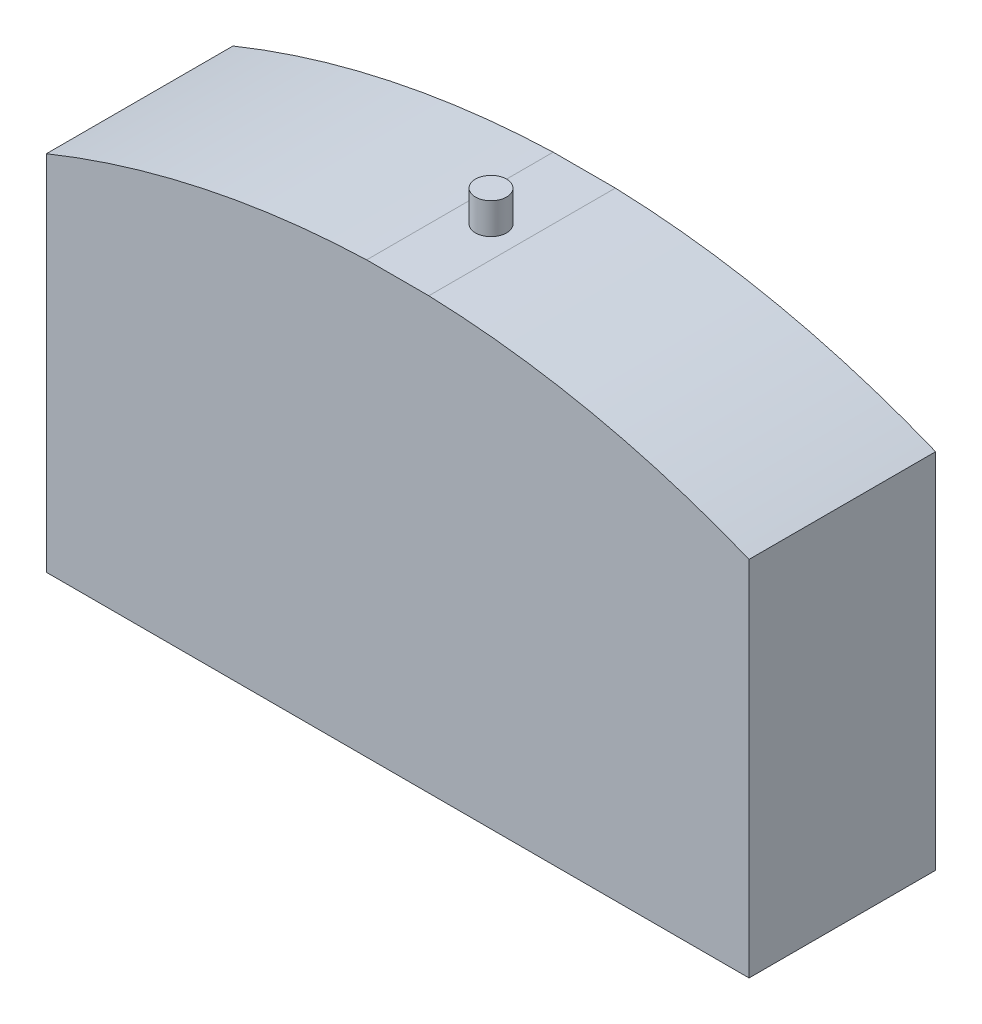
ISO-10303-21;
HEADER;
FILE_DESCRIPTION(('STEP AP214'),'2;1');
FILE_NAME('part.step','',(''),(''),'','','');
FILE_SCHEMA(('AUTOMOTIVE_DESIGN { 1 0 10303 214 1 1 1 1 }'));
ENDSEC;
DATA;
#1=APPLICATION_CONTEXT('core data for automotive mechanical design processes');
#2=APPLICATION_PROTOCOL_DEFINITION('international standard','automotive_design',2000,#1);
#3=PRODUCT_CONTEXT('',#1,'mechanical');
#4=PRODUCT('Part','Part','',(#3));
#5=PRODUCT_RELATED_PRODUCT_CATEGORY('part','',(#4));
#6=PRODUCT_DEFINITION_FORMATION('','',#4);
#7=PRODUCT_DEFINITION_CONTEXT('part definition',#1,'design');
#8=PRODUCT_DEFINITION('design','',#6,#7);
#9=PRODUCT_DEFINITION_SHAPE('','',#8);
#10=(LENGTH_UNIT() NAMED_UNIT(*) SI_UNIT(.MILLI.,.METRE.));
#11=(NAMED_UNIT(*) PLANE_ANGLE_UNIT() SI_UNIT($,.RADIAN.));
#12=(NAMED_UNIT(*) SI_UNIT($,.STERADIAN.) SOLID_ANGLE_UNIT());
#13=UNCERTAINTY_MEASURE_WITH_UNIT(LENGTH_MEASURE(1.E-05),#10,'distance_accuracy_value','');
#14=(GEOMETRIC_REPRESENTATION_CONTEXT(3) GLOBAL_UNCERTAINTY_ASSIGNED_CONTEXT((#13)) GLOBAL_UNIT_ASSIGNED_CONTEXT((#10,
#11,#12)) REPRESENTATION_CONTEXT('',''));
#15=CARTESIAN_POINT('',(0.,0.,0.));
#16=DIRECTION('',(0.,0.,1.));
#17=DIRECTION('',(1.,0.,0.));
#18=AXIS2_PLACEMENT_3D('',#15,#16,#17);
#19=CARTESIAN_POINT('',(0.,0.,30.));
#20=DIRECTION('',(0.,0.,-1.));
#21=DIRECTION('',(-1.,0.,0.));
#22=AXIS2_PLACEMENT_3D('',#19,#20,#21);
#23=CYLINDRICAL_SURFACE('',#22,150.);
#24=CARTESIAN_POINT('',(0.,0.,0.));
#25=DIRECTION('',(0.,0.,1.));
#26=DIRECTION('',(1.,0.,0.));
#27=AXIS2_PLACEMENT_3D('',#24,#25,#26);
#28=CIRCLE('',#27,150.);
#29=CARTESIAN_POINT('',(-5.,149.916643505649,0.));
#30=VERTEX_POINT('',#29);
#31=CARTESIAN_POINT('',(-56.5,138.952329955276,0.));
#32=VERTEX_POINT('',#31);
#33=EDGE_CURVE('E134',#30,#32,#28,.T.);
#34=ORIENTED_EDGE('',*,*,#33,.T.);
#35=DIRECTION('',(0.,0.,-1.));
#36=VECTOR('',#35,1.);
#37=CARTESIAN_POINT('',(-56.5,138.952329955276,30.));
#38=LINE('',#37,#36);
#39=CARTESIAN_POINT('',(-56.5,138.952329955276,30.));
#40=VERTEX_POINT('',#39);
#41=EDGE_CURVE('E39',#40,#32,#38,.T.);
#42=ORIENTED_EDGE('',*,*,#41,.F.);
#43=CARTESIAN_POINT('',(0.,0.,30.));
#44=DIRECTION('',(0.,0.,1.));
#45=DIRECTION('',(1.,0.,0.));
#46=AXIS2_PLACEMENT_3D('',#43,#44,#45);
#47=CIRCLE('',#46,150.);
#48=CARTESIAN_POINT('',(-5.,149.916643505649,30.));
#49=VERTEX_POINT('',#48);
#50=EDGE_CURVE('E146',#49,#40,#47,.T.);
#51=ORIENTED_EDGE('',*,*,#50,.F.);
#52=DIRECTION('',(0.,0.,-1.));
#53=VECTOR('',#52,1.);
#54=CARTESIAN_POINT('',(-5.,149.916643505649,30.));
#55=LINE('',#54,#53);
#56=EDGE_CURVE('E130',#49,#30,#55,.T.);
#57=ORIENTED_EDGE('',*,*,#56,.T.);
#58=EDGE_LOOP('',(#34,#42,#51,#57));
#59=FACE_BOUND('',#58,.T.);
#60=ADVANCED_FACE('F36',(#59),#23,.T.);
#61=CARTESIAN_POINT('',(-56.5,138.952329955276,30.));
#62=DIRECTION('',(1.,0.,0.));
#63=DIRECTION('',(0.,1.,0.));
#64=AXIS2_PLACEMENT_3D('',#61,#62,#63);
#65=PLANE('',#64);
#66=DIRECTION('',(0.,-1.,0.));
#67=VECTOR('',#66,1.);
#68=CARTESIAN_POINT('',(-56.5,138.952329955276,0.));
#69=LINE('',#68,#67);
#70=CARTESIAN_POINT('',(-56.5,80.6523299552764,0.));
#71=VERTEX_POINT('',#70);
#72=EDGE_CURVE('E137',#32,#71,#69,.T.);
#73=ORIENTED_EDGE('',*,*,#72,.T.);
#74=DIRECTION('',(0.,0.,-1.));
#75=VECTOR('',#74,1.);
#76=CARTESIAN_POINT('',(-56.5,80.6523299552764,30.));
#77=LINE('',#76,#75);
#78=CARTESIAN_POINT('',(-56.5,80.6523299552764,30.));
#79=VERTEX_POINT('',#78);
#80=EDGE_CURVE('E149',#79,#71,#77,.T.);
#81=ORIENTED_EDGE('',*,*,#80,.F.);
#82=DIRECTION('',(0.,-1.,0.));
#83=VECTOR('',#82,1.);
#84=CARTESIAN_POINT('',(-56.5,138.952329955276,30.));
#85=LINE('',#84,#83);
#86=EDGE_CURVE('E96',#40,#79,#85,.T.);
#87=ORIENTED_EDGE('',*,*,#86,.F.);
#88=ORIENTED_EDGE('',*,*,#41,.T.);
#89=EDGE_LOOP('',(#73,#81,#87,#88));
#90=FACE_BOUND('',#89,.T.);
#91=ADVANCED_FACE('F154',(#90),#65,.F.);
#92=CARTESIAN_POINT('',(-56.5,80.6523299552764,30.));
#93=DIRECTION('',(0.,1.,0.));
#94=DIRECTION('',(0.,0.,1.));
#95=AXIS2_PLACEMENT_3D('',#92,#93,#94);
#96=PLANE('',#95);
#97=DIRECTION('',(1.,0.,0.));
#98=VECTOR('',#97,1.);
#99=CARTESIAN_POINT('',(-56.5,80.6523299552764,0.));
#100=LINE('',#99,#98);
#101=CARTESIAN_POINT('',(56.5,80.6523299552764,0.));
#102=VERTEX_POINT('',#101);
#103=EDGE_CURVE('E140',#71,#102,#100,.T.);
#104=ORIENTED_EDGE('',*,*,#103,.T.);
#105=DIRECTION('',(0.,0.,-1.));
#106=VECTOR('',#105,1.);
#107=CARTESIAN_POINT('',(56.5,80.6523299552764,30.));
#108=LINE('',#107,#106);
#109=CARTESIAN_POINT('',(56.5,80.6523299552764,30.));
#110=VERTEX_POINT('',#109);
#111=EDGE_CURVE('E125',#110,#102,#108,.T.);
#112=ORIENTED_EDGE('',*,*,#111,.F.);
#113=DIRECTION('',(1.,0.,0.));
#114=VECTOR('',#113,1.);
#115=CARTESIAN_POINT('',(-56.5,80.6523299552764,30.));
#116=LINE('',#115,#114);
#117=EDGE_CURVE('E113',#79,#110,#116,.T.);
#118=ORIENTED_EDGE('',*,*,#117,.F.);
#119=ORIENTED_EDGE('',*,*,#80,.T.);
#120=EDGE_LOOP('',(#104,#112,#118,#119));
#121=FACE_BOUND('',#120,.T.);
#122=ADVANCED_FACE('F160',(#121),#96,.F.);
#123=CARTESIAN_POINT('',(56.5,138.952329955276,30.));
#124=DIRECTION('',(-1.,0.,0.));
#125=DIRECTION('',(0.,0.,1.));
#126=AXIS2_PLACEMENT_3D('',#123,#124,#125);
#127=PLANE('',#126);
#128=DIRECTION('',(0.,1.,0.));
#129=VECTOR('',#128,1.);
#130=CARTESIAN_POINT('',(56.5,138.952329955276,0.));
#131=LINE('',#130,#129);
#132=CARTESIAN_POINT('',(56.5,138.952329955276,0.));
#133=VERTEX_POINT('',#132);
#134=EDGE_CURVE('E122',#102,#133,#131,.T.);
#135=ORIENTED_EDGE('',*,*,#134,.T.);
#136=DIRECTION('',(0.,0.,-1.));
#137=VECTOR('',#136,1.);
#138=CARTESIAN_POINT('',(56.5,138.952329955276,30.));
#139=LINE('',#138,#137);
#140=CARTESIAN_POINT('',(56.5,138.952329955276,30.));
#141=VERTEX_POINT('',#140);
#142=EDGE_CURVE('E119',#141,#133,#139,.T.);
#143=ORIENTED_EDGE('',*,*,#142,.F.);
#144=DIRECTION('',(0.,1.,0.));
#145=VECTOR('',#144,1.);
#146=CARTESIAN_POINT('',(56.5,138.952329955276,30.));
#147=LINE('',#146,#145);
#148=EDGE_CURVE('E106',#110,#141,#147,.T.);
#149=ORIENTED_EDGE('',*,*,#148,.F.);
#150=ORIENTED_EDGE('',*,*,#111,.T.);
#151=EDGE_LOOP('',(#135,#143,#149,#150));
#152=FACE_BOUND('',#151,.T.);
#153=ADVANCED_FACE('F120',(#152),#127,.F.);
#154=CARTESIAN_POINT('',(0.,0.,30.));
#155=DIRECTION('',(0.,0.,-1.));
#156=DIRECTION('',(-1.,0.,0.));
#157=AXIS2_PLACEMENT_3D('',#154,#155,#156);
#158=CYLINDRICAL_SURFACE('',#157,150.);
#159=CARTESIAN_POINT('',(0.,0.,0.));
#160=DIRECTION('',(0.,0.,1.));
#161=DIRECTION('',(1.,0.,0.));
#162=AXIS2_PLACEMENT_3D('',#159,#160,#161);
#163=CIRCLE('',#162,150.);
#164=CARTESIAN_POINT('',(5.,149.916643505649,0.));
#165=VERTEX_POINT('',#164);
#166=EDGE_CURVE('E143',#133,#165,#163,.T.);
#167=ORIENTED_EDGE('',*,*,#166,.T.);
#168=DIRECTION('',(0.,0.,-1.));
#169=VECTOR('',#168,1.);
#170=CARTESIAN_POINT('',(5.,149.916643505649,30.));
#171=LINE('',#170,#169);
#172=CARTESIAN_POINT('',(5.,149.916643505649,30.));
#173=VERTEX_POINT('',#172);
#174=EDGE_CURVE('E126',#173,#165,#171,.T.);
#175=ORIENTED_EDGE('',*,*,#174,.F.);
#176=CARTESIAN_POINT('',(0.,0.,30.));
#177=DIRECTION('',(0.,0.,1.));
#178=DIRECTION('',(1.,0.,0.));
#179=AXIS2_PLACEMENT_3D('',#176,#177,#178);
#180=CIRCLE('',#179,150.);
#181=EDGE_CURVE('E110',#141,#173,#180,.T.);
#182=ORIENTED_EDGE('',*,*,#181,.F.);
#183=ORIENTED_EDGE('',*,*,#142,.T.);
#184=EDGE_LOOP('',(#167,#175,#182,#183));
#185=FACE_BOUND('',#184,.T.);
#186=ADVANCED_FACE('F128',(#185),#158,.T.);
#187=CARTESIAN_POINT('',(-5.,149.916643505649,30.));
#188=DIRECTION('',(0.,-1.,0.));
#189=DIRECTION('',(0.,0.,-1.));
#190=AXIS2_PLACEMENT_3D('',#187,#188,#189);
#191=PLANE('',#190);
#192=CARTESIAN_POINT('',(0.,149.916643505649,15.));
#193=DIRECTION('',(0.,1.,0.));
#194=DIRECTION('',(0.,0.,1.));
#195=AXIS2_PLACEMENT_3D('',#192,#193,#194);
#196=CIRCLE('',#195,2.5);
#197=CARTESIAN_POINT('',(0.,149.916643505649,17.5));
#198=VERTEX_POINT('',#197);
#199=EDGE_CURVE('E11',#198,#198,#196,.T.);
#200=ORIENTED_EDGE('',*,*,#199,.F.);
#201=EDGE_LOOP('',(#200));
#202=FACE_BOUND('',#201,.T.);
#203=DIRECTION('',(-1.,0.,0.));
#204=VECTOR('',#203,1.);
#205=CARTESIAN_POINT('',(-5.,149.916643505649,0.));
#206=LINE('',#205,#204);
#207=EDGE_CURVE('E87',#165,#30,#206,.T.);
#208=ORIENTED_EDGE('',*,*,#207,.T.);
#209=ORIENTED_EDGE('',*,*,#56,.F.);
#210=DIRECTION('',(-1.,0.,0.));
#211=VECTOR('',#210,1.);
#212=CARTESIAN_POINT('',(-5.,149.916643505649,30.));
#213=LINE('',#212,#211);
#214=EDGE_CURVE('E60',#173,#49,#213,.T.);
#215=ORIENTED_EDGE('',*,*,#214,.F.);
#216=ORIENTED_EDGE('',*,*,#174,.T.);
#217=EDGE_LOOP('',(#208,#209,#215,#216));
#218=FACE_BOUND('',#217,.T.);
#219=ADVANCED_FACE('F226',(#202,#218),#191,.F.);
#220=CARTESIAN_POINT('',(0.,0.,30.));
#221=DIRECTION('',(0.,0.,1.));
#222=DIRECTION('',(1.,0.,0.));
#223=AXIS2_PLACEMENT_3D('',#220,#221,#222);
#224=PLANE('',#223);
#225=ORIENTED_EDGE('',*,*,#50,.T.);
#226=ORIENTED_EDGE('',*,*,#86,.T.);
#227=ORIENTED_EDGE('',*,*,#117,.T.);
#228=ORIENTED_EDGE('',*,*,#148,.T.);
#229=ORIENTED_EDGE('',*,*,#181,.T.);
#230=ORIENTED_EDGE('',*,*,#214,.T.);
#231=EDGE_LOOP('',(#225,#226,#227,#228,#229,#230));
#232=FACE_BOUND('',#231,.T.);
#233=ADVANCED_FACE('F108',(#232),#224,.T.);
#234=CARTESIAN_POINT('',(0.,0.,0.));
#235=DIRECTION('',(0.,0.,1.));
#236=DIRECTION('',(1.,0.,0.));
#237=AXIS2_PLACEMENT_3D('',#234,#235,#236);
#238=PLANE('',#237);
#239=DIRECTION('',(1.,0.,0.));
#240=VECTOR('',#239,1.);
#241=CARTESIAN_POINT('',(-4.94973343059102,146.916643505649,0.));
#242=LINE('',#241,#240);
#243=CARTESIAN_POINT('',(-4.94973343059102,146.916643505649,0.));
#244=VERTEX_POINT('',#243);
#245=CARTESIAN_POINT('',(4.94973343059103,146.916643505649,0.));
#246=VERTEX_POINT('',#245);
#247=EDGE_CURVE('E193',#244,#246,#242,.T.);
#248=ORIENTED_EDGE('',*,*,#247,.F.);
#249=CARTESIAN_POINT('',(0.,0.,0.));
#250=DIRECTION('',(0.,0.,-1.));
#251=DIRECTION('',(-1.,0.,0.));
#252=AXIS2_PLACEMENT_3D('',#249,#250,#251);
#253=CIRCLE('',#252,147.);
#254=CARTESIAN_POINT('',(-53.5,136.918771539917,0.));
#255=VERTEX_POINT('',#254);
#256=EDGE_CURVE('E51',#255,#244,#253,.T.);
#257=ORIENTED_EDGE('',*,*,#256,.F.);
#258=DIRECTION('',(0.,1.,0.));
#259=VECTOR('',#258,1.);
#260=CARTESIAN_POINT('',(-53.5,83.6523299552764,0.));
#261=LINE('',#260,#259);
#262=CARTESIAN_POINT('',(-53.5,83.6523299552764,0.));
#263=VERTEX_POINT('',#262);
#264=EDGE_CURVE('E180',#263,#255,#261,.T.);
#265=ORIENTED_EDGE('',*,*,#264,.F.);
#266=DIRECTION('',(-1.,0.,0.));
#267=VECTOR('',#266,1.);
#268=CARTESIAN_POINT('',(53.5,83.6523299552764,0.));
#269=LINE('',#268,#267);
#270=CARTESIAN_POINT('',(53.5,83.6523299552764,0.));
#271=VERTEX_POINT('',#270);
#272=EDGE_CURVE('E184',#271,#263,#269,.T.);
#273=ORIENTED_EDGE('',*,*,#272,.F.);
#274=DIRECTION('',(0.,-1.,0.));
#275=VECTOR('',#274,1.);
#276=CARTESIAN_POINT('',(53.5,136.918771539917,0.));
#277=LINE('',#276,#275);
#278=CARTESIAN_POINT('',(53.5,136.918771539917,0.));
#279=VERTEX_POINT('',#278);
#280=EDGE_CURVE('E187',#279,#271,#277,.T.);
#281=ORIENTED_EDGE('',*,*,#280,.F.);
#282=CARTESIAN_POINT('',(0.,0.,0.));
#283=DIRECTION('',(0.,0.,-1.));
#284=DIRECTION('',(-1.,0.,0.));
#285=AXIS2_PLACEMENT_3D('',#282,#283,#284);
#286=CIRCLE('',#285,147.);
#287=EDGE_CURVE('E190',#246,#279,#286,.T.);
#288=ORIENTED_EDGE('',*,*,#287,.F.);
#289=EDGE_LOOP('',(#248,#257,#265,#273,#281,#288));
#290=FACE_BOUND('',#289,.T.);
#291=ORIENTED_EDGE('',*,*,#33,.F.);
#292=ORIENTED_EDGE('',*,*,#207,.F.);
#293=ORIENTED_EDGE('',*,*,#166,.F.);
#294=ORIENTED_EDGE('',*,*,#134,.F.);
#295=ORIENTED_EDGE('',*,*,#103,.F.);
#296=ORIENTED_EDGE('',*,*,#72,.F.);
#297=EDGE_LOOP('',(#291,#292,#293,#294,#295,#296));
#298=FACE_BOUND('',#297,.T.);
#299=ADVANCED_FACE('F159',(#290,#298),#238,.F.);
#300=CARTESIAN_POINT('',(0.,0.,27.));
#301=DIRECTION('',(0.,0.,-1.));
#302=DIRECTION('',(-1.,0.,0.));
#303=AXIS2_PLACEMENT_3D('',#300,#301,#302);
#304=CYLINDRICAL_SURFACE('',#303,147.);
#305=ORIENTED_EDGE('',*,*,#256,.T.);
#306=DIRECTION('',(0.,0.,-1.));
#307=VECTOR('',#306,1.);
#308=CARTESIAN_POINT('',(-4.94973343059102,146.916643505649,27.));
#309=LINE('',#308,#307);
#310=CARTESIAN_POINT('',(-4.94973343059102,146.916643505649,27.));
#311=VERTEX_POINT('',#310);
#312=EDGE_CURVE('E164',#311,#244,#309,.T.);
#313=ORIENTED_EDGE('',*,*,#312,.F.);
#314=CARTESIAN_POINT('',(0.,0.,27.));
#315=DIRECTION('',(0.,0.,-1.));
#316=DIRECTION('',(-1.,0.,0.));
#317=AXIS2_PLACEMENT_3D('',#314,#315,#316);
#318=CIRCLE('',#317,147.);
#319=CARTESIAN_POINT('',(-53.5,136.918771539917,27.));
#320=VERTEX_POINT('',#319);
#321=EDGE_CURVE('E183',#320,#311,#318,.T.);
#322=ORIENTED_EDGE('',*,*,#321,.F.);
#323=DIRECTION('',(0.,0.,-1.));
#324=VECTOR('',#323,1.);
#325=CARTESIAN_POINT('',(-53.5,136.918771539917,27.));
#326=LINE('',#325,#324);
#327=EDGE_CURVE('E138',#320,#255,#326,.T.);
#328=ORIENTED_EDGE('',*,*,#327,.T.);
#329=EDGE_LOOP('',(#305,#313,#322,#328));
#330=FACE_BOUND('',#329,.T.);
#331=ADVANCED_FACE('F272',(#330),#304,.F.);
#332=CARTESIAN_POINT('',(-53.5,83.6523299552764,27.));
#333=DIRECTION('',(-1.,0.,0.));
#334=DIRECTION('',(0.,-1.,0.));
#335=AXIS2_PLACEMENT_3D('',#332,#333,#334);
#336=PLANE('',#335);
#337=ORIENTED_EDGE('',*,*,#264,.T.);
#338=ORIENTED_EDGE('',*,*,#327,.F.);
#339=DIRECTION('',(0.,1.,0.));
#340=VECTOR('',#339,1.);
#341=CARTESIAN_POINT('',(-53.5,83.6523299552764,27.));
#342=LINE('',#341,#340);
#343=CARTESIAN_POINT('',(-53.5,83.6523299552764,27.));
#344=VERTEX_POINT('',#343);
#345=EDGE_CURVE('E167',#344,#320,#342,.T.);
#346=ORIENTED_EDGE('',*,*,#345,.F.);
#347=DIRECTION('',(0.,0.,-1.));
#348=VECTOR('',#347,1.);
#349=CARTESIAN_POINT('',(-53.5,83.6523299552764,27.));
#350=LINE('',#349,#348);
#351=EDGE_CURVE('E176',#344,#263,#350,.T.);
#352=ORIENTED_EDGE('',*,*,#351,.T.);
#353=EDGE_LOOP('',(#337,#338,#346,#352));
#354=FACE_BOUND('',#353,.T.);
#355=ADVANCED_FACE('F282',(#354),#336,.F.);
#356=CARTESIAN_POINT('',(53.5,83.6523299552764,27.));
#357=DIRECTION('',(0.,-1.,0.));
#358=DIRECTION('',(0.,0.,-1.));
#359=AXIS2_PLACEMENT_3D('',#356,#357,#358);
#360=PLANE('',#359);
#361=ORIENTED_EDGE('',*,*,#272,.T.);
#362=ORIENTED_EDGE('',*,*,#351,.F.);
#363=DIRECTION('',(-1.,0.,0.));
#364=VECTOR('',#363,1.);
#365=CARTESIAN_POINT('',(53.5,83.6523299552764,27.));
#366=LINE('',#365,#364);
#367=CARTESIAN_POINT('',(53.5,83.6523299552764,27.));
#368=VERTEX_POINT('',#367);
#369=EDGE_CURVE('E200',#368,#344,#366,.T.);
#370=ORIENTED_EDGE('',*,*,#369,.F.);
#371=DIRECTION('',(0.,0.,-1.));
#372=VECTOR('',#371,1.);
#373=CARTESIAN_POINT('',(53.5,83.6523299552764,27.));
#374=LINE('',#373,#372);
#375=EDGE_CURVE('E173',#368,#271,#374,.T.);
#376=ORIENTED_EDGE('',*,*,#375,.T.);
#377=EDGE_LOOP('',(#361,#362,#370,#376));
#378=FACE_BOUND('',#377,.T.);
#379=ADVANCED_FACE('F292',(#378),#360,.F.);
#380=CARTESIAN_POINT('',(53.5,136.918771539917,27.));
#381=DIRECTION('',(1.,0.,0.));
#382=DIRECTION('',(0.,1.,0.));
#383=AXIS2_PLACEMENT_3D('',#380,#381,#382);
#384=PLANE('',#383);
#385=ORIENTED_EDGE('',*,*,#280,.T.);
#386=ORIENTED_EDGE('',*,*,#375,.F.);
#387=DIRECTION('',(0.,-1.,0.));
#388=VECTOR('',#387,1.);
#389=CARTESIAN_POINT('',(53.5,136.918771539917,27.));
#390=LINE('',#389,#388);
#391=CARTESIAN_POINT('',(53.5,136.918771539917,27.));
#392=VERTEX_POINT('',#391);
#393=EDGE_CURVE('E203',#392,#368,#390,.T.);
#394=ORIENTED_EDGE('',*,*,#393,.F.);
#395=DIRECTION('',(0.,0.,-1.));
#396=VECTOR('',#395,1.);
#397=CARTESIAN_POINT('',(53.5,136.918771539917,27.));
#398=LINE('',#397,#396);
#399=EDGE_CURVE('E170',#392,#279,#398,.T.);
#400=ORIENTED_EDGE('',*,*,#399,.T.);
#401=EDGE_LOOP('',(#385,#386,#394,#400));
#402=FACE_BOUND('',#401,.T.);
#403=ADVANCED_FACE('F303',(#402),#384,.F.);
#404=CARTESIAN_POINT('',(0.,0.,27.));
#405=DIRECTION('',(0.,0.,-1.));
#406=DIRECTION('',(-1.,0.,0.));
#407=AXIS2_PLACEMENT_3D('',#404,#405,#406);
#408=CYLINDRICAL_SURFACE('',#407,147.);
#409=ORIENTED_EDGE('',*,*,#287,.T.);
#410=ORIENTED_EDGE('',*,*,#399,.F.);
#411=CARTESIAN_POINT('',(0.,0.,27.));
#412=DIRECTION('',(0.,0.,-1.));
#413=DIRECTION('',(-1.,0.,0.));
#414=AXIS2_PLACEMENT_3D('',#411,#412,#413);
#415=CIRCLE('',#414,147.);
#416=CARTESIAN_POINT('',(4.94973343059103,146.916643505649,27.));
#417=VERTEX_POINT('',#416);
#418=EDGE_CURVE('E206',#417,#392,#415,.T.);
#419=ORIENTED_EDGE('',*,*,#418,.F.);
#420=DIRECTION('',(0.,0.,-1.));
#421=VECTOR('',#420,1.);
#422=CARTESIAN_POINT('',(4.94973343059103,146.916643505649,27.));
#423=LINE('',#422,#421);
#424=EDGE_CURVE('E166',#417,#246,#423,.T.);
#425=ORIENTED_EDGE('',*,*,#424,.T.);
#426=EDGE_LOOP('',(#409,#410,#419,#425));
#427=FACE_BOUND('',#426,.T.);
#428=ADVANCED_FACE('F314',(#427),#408,.F.);
#429=CARTESIAN_POINT('',(-4.94973343059102,146.916643505649,27.));
#430=DIRECTION('',(0.,1.,0.));
#431=DIRECTION('',(0.,0.,1.));
#432=AXIS2_PLACEMENT_3D('',#429,#430,#431);
#433=PLANE('',#432);
#434=ORIENTED_EDGE('',*,*,#247,.T.);
#435=ORIENTED_EDGE('',*,*,#424,.F.);
#436=DIRECTION('',(1.,0.,0.));
#437=VECTOR('',#436,1.);
#438=CARTESIAN_POINT('',(-4.94973343059102,146.916643505649,27.));
#439=LINE('',#438,#437);
#440=EDGE_CURVE('E209',#311,#417,#439,.T.);
#441=ORIENTED_EDGE('',*,*,#440,.F.);
#442=ORIENTED_EDGE('',*,*,#312,.T.);
#443=EDGE_LOOP('',(#434,#435,#441,#442));
#444=FACE_BOUND('',#443,.T.);
#445=ADVANCED_FACE('F325',(#444),#433,.F.);
#446=CARTESIAN_POINT('',(0.,0.,27.));
#447=DIRECTION('',(0.,0.,-1.));
#448=DIRECTION('',(-1.,0.,0.));
#449=AXIS2_PLACEMENT_3D('',#446,#447,#448);
#450=PLANE('',#449);
#451=ORIENTED_EDGE('',*,*,#321,.T.);
#452=ORIENTED_EDGE('',*,*,#440,.T.);
#453=ORIENTED_EDGE('',*,*,#418,.T.);
#454=ORIENTED_EDGE('',*,*,#393,.T.);
#455=ORIENTED_EDGE('',*,*,#369,.T.);
#456=ORIENTED_EDGE('',*,*,#345,.T.);
#457=EDGE_LOOP('',(#451,#452,#453,#454,#455,#456));
#458=FACE_BOUND('',#457,.T.);
#459=ADVANCED_FACE('F222',(#458),#450,.T.);
#460=CARTESIAN_POINT('',(0.,154.916643505649,15.));
#461=DIRECTION('',(0.,-1.,0.));
#462=DIRECTION('',(0.,0.,-1.));
#463=AXIS2_PLACEMENT_3D('',#460,#461,#462);
#464=CYLINDRICAL_SURFACE('',#463,2.5);
#465=CARTESIAN_POINT('',(0.,154.916643505649,15.));
#466=DIRECTION('',(0.,1.,0.));
#467=DIRECTION('',(0.,0.,1.));
#468=AXIS2_PLACEMENT_3D('',#465,#466,#467);
#469=CIRCLE('',#468,2.5);
#470=CARTESIAN_POINT('',(0.,154.916643505649,17.5));
#471=VERTEX_POINT('',#470);
#472=EDGE_CURVE('E197',#471,#471,#469,.T.);
#473=ORIENTED_EDGE('',*,*,#472,.F.);
#474=EDGE_LOOP('',(#473));
#475=FACE_BOUND('',#474,.T.);
#476=ORIENTED_EDGE('',*,*,#199,.T.);
#477=EDGE_LOOP('',(#476));
#478=FACE_BOUND('',#477,.T.);
#479=ADVANCED_FACE('F219',(#475,#478),#464,.T.);
#480=CARTESIAN_POINT('',(0.,154.916643505649,15.));
#481=DIRECTION('',(0.,1.,0.));
#482=DIRECTION('',(0.,0.,1.));
#483=AXIS2_PLACEMENT_3D('',#480,#481,#482);
#484=PLANE('',#483);
#485=ORIENTED_EDGE('',*,*,#472,.T.);
#486=EDGE_LOOP('',(#485));
#487=FACE_BOUND('',#486,.T.);
#488=ADVANCED_FACE('F217',(#487),#484,.T.);
#489=CLOSED_SHELL('',(#60,#91,#122,#153,#186,#219,#233,#299,#331,#355,#379,#403,#428,#445,#459,
#479,#488));
#490=MANIFOLD_SOLID_BREP('B2',#489);
#491=ADVANCED_BREP_SHAPE_REPRESENTATION('',(#18,#490),#14);
#492=SHAPE_DEFINITION_REPRESENTATION(#9,#491);
ENDSEC;
END-ISO-10303-21;
